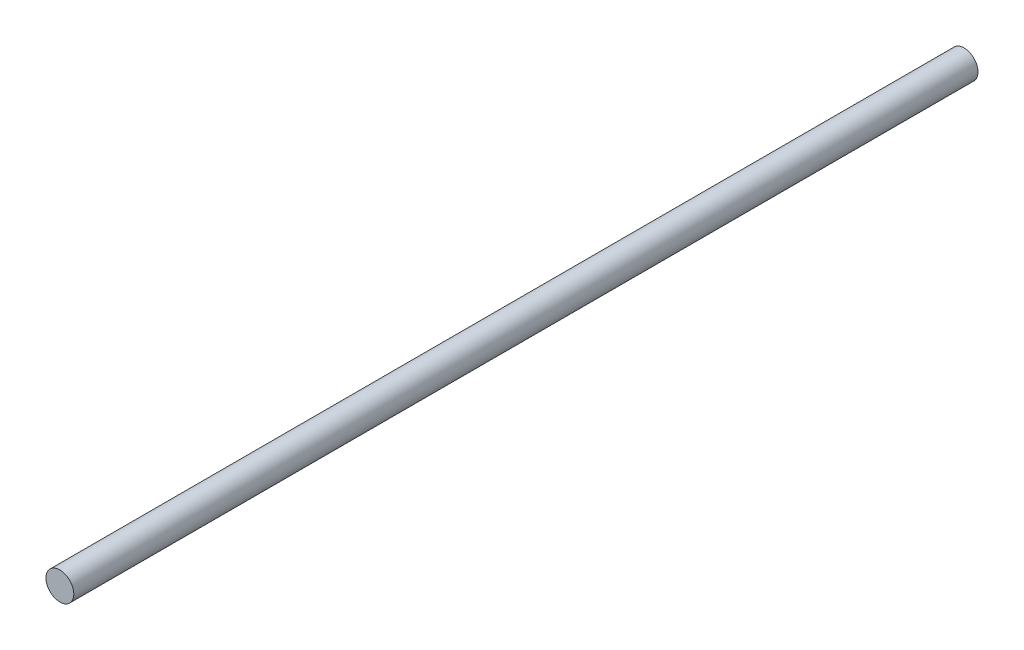
ISO-10303-21;
HEADER;
FILE_DESCRIPTION(('STEP AP214'),'2;1');
FILE_NAME('part.step','',(''),(''),'','','');
FILE_SCHEMA(('AUTOMOTIVE_DESIGN { 1 0 10303 214 1 1 1 1 }'));
ENDSEC;
DATA;
#1=APPLICATION_CONTEXT('core data for automotive mechanical design processes');
#2=APPLICATION_PROTOCOL_DEFINITION('international standard','automotive_design',2000,#1);
#3=PRODUCT_CONTEXT('',#1,'mechanical');
#4=PRODUCT('Part','Part','',(#3));
#5=PRODUCT_RELATED_PRODUCT_CATEGORY('part','',(#4));
#6=PRODUCT_DEFINITION_FORMATION('','',#4);
#7=PRODUCT_DEFINITION_CONTEXT('part definition',#1,'design');
#8=PRODUCT_DEFINITION('design','',#6,#7);
#9=PRODUCT_DEFINITION_SHAPE('','',#8);
#10=(LENGTH_UNIT() NAMED_UNIT(*) SI_UNIT(.MILLI.,.METRE.));
#11=(NAMED_UNIT(*) PLANE_ANGLE_UNIT() SI_UNIT($,.RADIAN.));
#12=(NAMED_UNIT(*) SI_UNIT($,.STERADIAN.) SOLID_ANGLE_UNIT());
#13=UNCERTAINTY_MEASURE_WITH_UNIT(LENGTH_MEASURE(1.E-05),#10,'distance_accuracy_value','');
#14=(GEOMETRIC_REPRESENTATION_CONTEXT(3) GLOBAL_UNCERTAINTY_ASSIGNED_CONTEXT((#13)) GLOBAL_UNIT_ASSIGNED_CONTEXT((#10,
#11,#12)) REPRESENTATION_CONTEXT('',''));
#15=CARTESIAN_POINT('',(0.,0.,0.));
#16=DIRECTION('',(0.,0.,1.));
#17=DIRECTION('',(1.,0.,0.));
#18=AXIS2_PLACEMENT_3D('',#15,#16,#17);
#19=CARTESIAN_POINT('',(0.,0.,260.));
#20=DIRECTION('',(0.,0.,-1.));
#21=DIRECTION('',(-1.,0.,0.));
#22=AXIS2_PLACEMENT_3D('',#19,#20,#21);
#23=CYLINDRICAL_SURFACE('',#22,4.);
#24=CARTESIAN_POINT('',(0.,0.,260.));
#25=DIRECTION('',(0.,0.,1.));
#26=DIRECTION('',(1.,0.,0.));
#27=AXIS2_PLACEMENT_3D('',#24,#25,#26);
#28=CIRCLE('',#27,4.);
#29=CARTESIAN_POINT('',(4.,0.,260.));
#30=VERTEX_POINT('',#29);
#31=EDGE_CURVE('E10',#30,#30,#28,.T.);
#32=ORIENTED_EDGE('',*,*,#31,.F.);
#33=EDGE_LOOP('',(#32));
#34=FACE_BOUND('',#33,.T.);
#35=CARTESIAN_POINT('',(0.,0.,0.));
#36=DIRECTION('',(0.,0.,1.));
#37=DIRECTION('',(1.,0.,0.));
#38=AXIS2_PLACEMENT_3D('',#35,#36,#37);
#39=CIRCLE('',#38,4.);
#40=CARTESIAN_POINT('',(4.,0.,0.));
#41=VERTEX_POINT('',#40);
#42=EDGE_CURVE('E33',#41,#41,#39,.T.);
#43=ORIENTED_EDGE('',*,*,#42,.T.);
#44=EDGE_LOOP('',(#43));
#45=FACE_BOUND('',#44,.T.);
#46=ADVANCED_FACE('F30',(#34,#45),#23,.T.);
#47=CARTESIAN_POINT('',(0.,0.,260.));
#48=DIRECTION('',(0.,0.,1.));
#49=DIRECTION('',(1.,0.,0.));
#50=AXIS2_PLACEMENT_3D('',#47,#48,#49);
#51=PLANE('',#50);
#52=ORIENTED_EDGE('',*,*,#31,.T.);
#53=EDGE_LOOP('',(#52));
#54=FACE_BOUND('',#53,.T.);
#55=ADVANCED_FACE('F45',(#54),#51,.T.);
#56=CARTESIAN_POINT('',(0.,0.,0.));
#57=DIRECTION('',(0.,0.,1.));
#58=DIRECTION('',(1.,0.,0.));
#59=AXIS2_PLACEMENT_3D('',#56,#57,#58);
#60=PLANE('',#59);
#61=ORIENTED_EDGE('',*,*,#42,.F.);
#62=EDGE_LOOP('',(#61));
#63=FACE_BOUND('',#62,.T.);
#64=ADVANCED_FACE('F43',(#63),#60,.F.);
#65=CLOSED_SHELL('',(#46,#55,#64));
#66=MANIFOLD_SOLID_BREP('B2',#65);
#67=ADVANCED_BREP_SHAPE_REPRESENTATION('',(#18,#66),#14);
#68=SHAPE_DEFINITION_REPRESENTATION(#9,#67);
ENDSEC;
END-ISO-10303-21;
